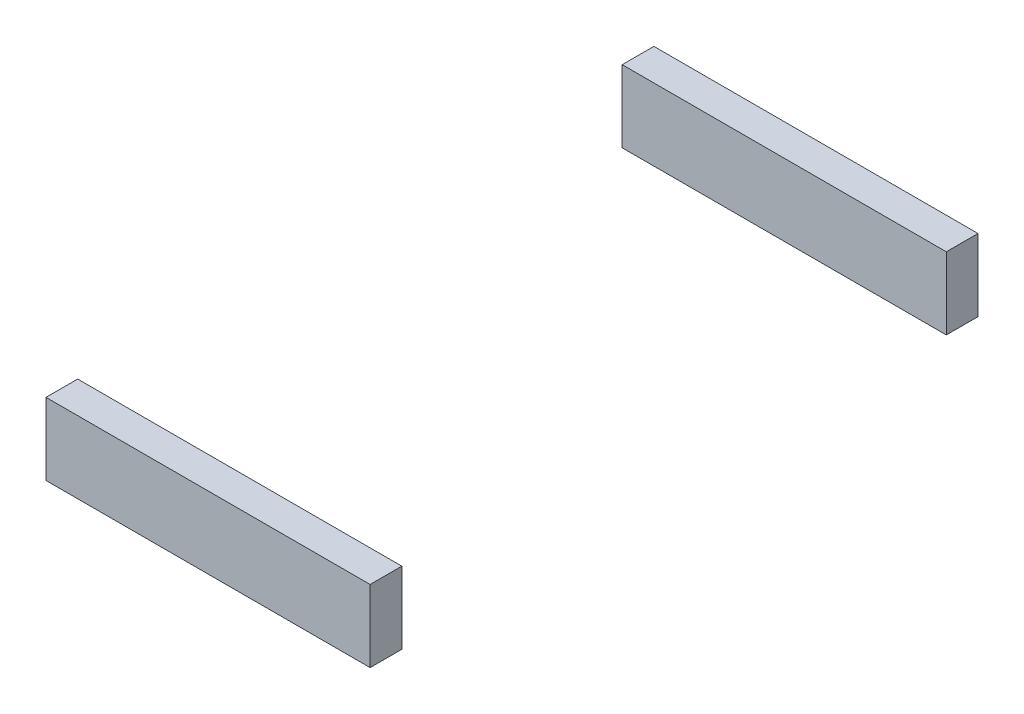
ISO-10303-21;
HEADER;
FILE_DESCRIPTION(('STEP AP214'),'2;1');
FILE_NAME('part.step','',(''),(''),'','','');
FILE_SCHEMA(('AUTOMOTIVE_DESIGN { 1 0 10303 214 1 1 1 1 }'));
ENDSEC;
DATA;
#1=APPLICATION_CONTEXT('core data for automotive mechanical design processes');
#2=APPLICATION_PROTOCOL_DEFINITION('international standard','automotive_design',2000,#1);
#3=PRODUCT_CONTEXT('',#1,'mechanical');
#4=PRODUCT('Part','Part','',(#3));
#5=PRODUCT_RELATED_PRODUCT_CATEGORY('part','',(#4));
#6=PRODUCT_DEFINITION_FORMATION('','',#4);
#7=PRODUCT_DEFINITION_CONTEXT('part definition',#1,'design');
#8=PRODUCT_DEFINITION('design','',#6,#7);
#9=PRODUCT_DEFINITION_SHAPE('','',#8);
#10=(LENGTH_UNIT() NAMED_UNIT(*) SI_UNIT(.MILLI.,.METRE.));
#11=(NAMED_UNIT(*) PLANE_ANGLE_UNIT() SI_UNIT($,.RADIAN.));
#12=(NAMED_UNIT(*) SI_UNIT($,.STERADIAN.) SOLID_ANGLE_UNIT());
#13=UNCERTAINTY_MEASURE_WITH_UNIT(LENGTH_MEASURE(1.E-05),#10,'distance_accuracy_value','');
#14=(GEOMETRIC_REPRESENTATION_CONTEXT(3) GLOBAL_UNCERTAINTY_ASSIGNED_CONTEXT((#13)) GLOBAL_UNIT_ASSIGNED_CONTEXT((#10,
#11,#12)) REPRESENTATION_CONTEXT('',''));
#15=CARTESIAN_POINT('',(0.,0.,0.));
#16=DIRECTION('',(0.,0.,1.));
#17=DIRECTION('',(1.,0.,0.));
#18=AXIS2_PLACEMENT_3D('',#15,#16,#17);
#19=CARTESIAN_POINT('',(-247.01,-0.01,422.));
#20=DIRECTION('',(0.,0.,1.));
#21=DIRECTION('',(1.,0.,0.));
#22=AXIS2_PLACEMENT_3D('',#19,#20,#21);
#23=PLANE('',#22);
#24=DIRECTION('',(1.,0.,0.));
#25=VECTOR('',#24,1.);
#26=CARTESIAN_POINT('',(-134.5,50.,422.));
#27=LINE('',#26,#25);
#28=CARTESIAN_POINT('',(-247.,50.,422.));
#29=VERTEX_POINT('',#28);
#30=CARTESIAN_POINT('',(-22.,50.,422.));
#31=VERTEX_POINT('',#30);
#32=EDGE_CURVE('P0_E69',#29,#31,#27,.T.);
#33=ORIENTED_EDGE('',*,*,#32,.F.);
#34=DIRECTION('',(0.,1.,0.));
#35=VECTOR('',#34,1.);
#36=CARTESIAN_POINT('',(-247.,25.,422.));
#37=LINE('',#36,#35);
#38=CARTESIAN_POINT('',(-247.,0.,422.));
#39=VERTEX_POINT('',#38);
#40=EDGE_CURVE('P0_E56',#39,#29,#37,.T.);
#41=ORIENTED_EDGE('',*,*,#40,.F.);
#42=DIRECTION('',(-1.,0.,0.));
#43=VECTOR('',#42,1.);
#44=CARTESIAN_POINT('',(-134.5,0.,422.));
#45=LINE('',#44,#43);
#46=CARTESIAN_POINT('',(-22.,0.,422.));
#47=VERTEX_POINT('',#46);
#48=EDGE_CURVE('P0_E21',#47,#39,#45,.T.);
#49=ORIENTED_EDGE('',*,*,#48,.F.);
#50=DIRECTION('',(0.,-1.,0.));
#51=VECTOR('',#50,1.);
#52=CARTESIAN_POINT('',(-22.,25.,422.));
#53=LINE('',#52,#51);
#54=EDGE_CURVE('P0_E82',#31,#47,#53,.T.);
#55=ORIENTED_EDGE('',*,*,#54,.F.);
#56=EDGE_LOOP('',(#33,#41,#49,#55));
#57=FACE_BOUND('',#56,.T.);
#58=ADVANCED_FACE('P0_F17',(#57),#23,.T.);
#59=CARTESIAN_POINT('',(-21.99,0.,422.01));
#60=DIRECTION('',(0.,-1.,0.));
#61=DIRECTION('',(-1.,0.,0.));
#62=AXIS2_PLACEMENT_3D('',#59,#60,#61);
#63=PLANE('',#62);
#64=DIRECTION('',(0.,0.,-1.));
#65=VECTOR('',#64,1.);
#66=CARTESIAN_POINT('',(-22.,0.,411.));
#67=LINE('',#66,#65);
#68=CARTESIAN_POINT('',(-22.,0.,400.));
#69=VERTEX_POINT('',#68);
#70=EDGE_CURVE('P0_E65',#47,#69,#67,.T.);
#71=ORIENTED_EDGE('',*,*,#70,.F.);
#72=ORIENTED_EDGE('',*,*,#48,.T.);
#73=DIRECTION('',(0.,0.,1.));
#74=VECTOR('',#73,1.);
#75=CARTESIAN_POINT('',(-247.,0.,411.));
#76=LINE('',#75,#74);
#77=CARTESIAN_POINT('',(-247.,0.,400.));
#78=VERTEX_POINT('',#77);
#79=EDGE_CURVE('P0_E62',#78,#39,#76,.T.);
#80=ORIENTED_EDGE('',*,*,#79,.F.);
#81=DIRECTION('',(-1.,0.,0.));
#82=VECTOR('',#81,1.);
#83=CARTESIAN_POINT('',(-134.5,0.,400.));
#84=LINE('',#83,#82);
#85=EDGE_CURVE('P0_E84',#69,#78,#84,.T.);
#86=ORIENTED_EDGE('',*,*,#85,.F.);
#87=EDGE_LOOP('',(#71,#72,#80,#86));
#88=FACE_BOUND('',#87,.T.);
#89=ADVANCED_FACE('P0_F61',(#88),#63,.T.);
#90=CARTESIAN_POINT('',(-247.,-0.01,399.99));
#91=DIRECTION('',(-1.,0.,0.));
#92=DIRECTION('',(0.,0.,1.));
#93=AXIS2_PLACEMENT_3D('',#90,#91,#92);
#94=PLANE('',#93);
#95=DIRECTION('',(0.,0.,1.));
#96=VECTOR('',#95,1.);
#97=CARTESIAN_POINT('',(-247.,50.,411.));
#98=LINE('',#97,#96);
#99=CARTESIAN_POINT('',(-247.,50.,400.));
#100=VERTEX_POINT('',#99);
#101=EDGE_CURVE('P0_E71',#100,#29,#98,.T.);
#102=ORIENTED_EDGE('',*,*,#101,.F.);
#103=DIRECTION('',(0.,1.,0.));
#104=VECTOR('',#103,1.);
#105=CARTESIAN_POINT('',(-247.,25.,400.));
#106=LINE('',#105,#104);
#107=EDGE_CURVE('P0_E75',#78,#100,#106,.T.);
#108=ORIENTED_EDGE('',*,*,#107,.F.);
#109=ORIENTED_EDGE('',*,*,#79,.T.);
#110=ORIENTED_EDGE('',*,*,#40,.T.);
#111=EDGE_LOOP('',(#102,#108,#109,#110));
#112=FACE_BOUND('',#111,.T.);
#113=ADVANCED_FACE('P0_F73',(#112),#94,.T.);
#114=CARTESIAN_POINT('',(-247.01,50.,399.99));
#115=DIRECTION('',(0.,1.,0.));
#116=DIRECTION('',(0.,0.,1.));
#117=AXIS2_PLACEMENT_3D('',#114,#115,#116);
#118=PLANE('',#117);
#119=DIRECTION('',(0.,0.,1.));
#120=VECTOR('',#119,1.);
#121=CARTESIAN_POINT('',(-22.,50.,411.));
#122=LINE('',#121,#120);
#123=CARTESIAN_POINT('',(-22.,50.,400.));
#124=VERTEX_POINT('',#123);
#125=EDGE_CURVE('P0_E36',#124,#31,#122,.T.);
#126=ORIENTED_EDGE('',*,*,#125,.F.);
#127=DIRECTION('',(1.,0.,0.));
#128=VECTOR('',#127,1.);
#129=CARTESIAN_POINT('',(-134.5,50.,400.));
#130=LINE('',#129,#128);
#131=EDGE_CURVE('P0_E27',#100,#124,#130,.T.);
#132=ORIENTED_EDGE('',*,*,#131,.F.);
#133=ORIENTED_EDGE('',*,*,#101,.T.);
#134=ORIENTED_EDGE('',*,*,#32,.T.);
#135=EDGE_LOOP('',(#126,#132,#133,#134));
#136=FACE_BOUND('',#135,.T.);
#137=ADVANCED_FACE('P0_F89',(#136),#118,.T.);
#138=CARTESIAN_POINT('',(-22.,-0.01,422.01));
#139=DIRECTION('',(1.,0.,0.));
#140=DIRECTION('',(0.,0.,-1.));
#141=AXIS2_PLACEMENT_3D('',#138,#139,#140);
#142=PLANE('',#141);
#143=ORIENTED_EDGE('',*,*,#125,.T.);
#144=ORIENTED_EDGE('',*,*,#54,.T.);
#145=ORIENTED_EDGE('',*,*,#70,.T.);
#146=DIRECTION('',(0.,-1.,0.));
#147=VECTOR('',#146,1.);
#148=CARTESIAN_POINT('',(-22.,25.,400.));
#149=LINE('',#148,#147);
#150=EDGE_CURVE('P0_E11',#124,#69,#149,.T.);
#151=ORIENTED_EDGE('',*,*,#150,.F.);
#152=EDGE_LOOP('',(#143,#144,#145,#151));
#153=FACE_BOUND('',#152,.T.);
#154=ADVANCED_FACE('P0_F91',(#153),#142,.T.);
#155=CARTESIAN_POINT('',(-21.99,-0.01,400.));
#156=DIRECTION('',(0.,0.,-1.));
#157=DIRECTION('',(-1.,0.,0.));
#158=AXIS2_PLACEMENT_3D('',#155,#156,#157);
#159=PLANE('',#158);
#160=ORIENTED_EDGE('',*,*,#131,.T.);
#161=ORIENTED_EDGE('',*,*,#150,.T.);
#162=ORIENTED_EDGE('',*,*,#85,.T.);
#163=ORIENTED_EDGE('',*,*,#107,.T.);
#164=EDGE_LOOP('',(#160,#161,#162,#163));
#165=FACE_BOUND('',#164,.T.);
#166=ADVANCED_FACE('P0_F19',(#165),#159,.T.);
#167=CLOSED_SHELL('',(#58,#89,#113,#137,#154,#166));
#168=MANIFOLD_SOLID_BREP('P0_B1',#167);
#169=CARTESIAN_POINT('',(-247.01,-0.01,22.));
#170=DIRECTION('',(0.,0.,1.));
#171=DIRECTION('',(1.,0.,0.));
#172=AXIS2_PLACEMENT_3D('',#169,#170,#171);
#173=PLANE('',#172);
#174=DIRECTION('',(1.,0.,0.));
#175=VECTOR('',#174,1.);
#176=CARTESIAN_POINT('',(-134.5,50.,22.));
#177=LINE('',#176,#175);
#178=CARTESIAN_POINT('',(-247.,50.,22.));
#179=VERTEX_POINT('',#178);
#180=CARTESIAN_POINT('',(-22.,50.,22.));
#181=VERTEX_POINT('',#180);
#182=EDGE_CURVE('P1_E69',#179,#181,#177,.T.);
#183=ORIENTED_EDGE('',*,*,#182,.F.);
#184=DIRECTION('',(0.,1.,0.));
#185=VECTOR('',#184,1.);
#186=CARTESIAN_POINT('',(-247.,25.,22.));
#187=LINE('',#186,#185);
#188=CARTESIAN_POINT('',(-247.,0.,22.));
#189=VERTEX_POINT('',#188);
#190=EDGE_CURVE('P1_E56',#189,#179,#187,.T.);
#191=ORIENTED_EDGE('',*,*,#190,.F.);
#192=DIRECTION('',(-1.,0.,0.));
#193=VECTOR('',#192,1.);
#194=CARTESIAN_POINT('',(-134.5,0.,22.));
#195=LINE('',#194,#193);
#196=CARTESIAN_POINT('',(-22.,0.,22.));
#197=VERTEX_POINT('',#196);
#198=EDGE_CURVE('P1_E21',#197,#189,#195,.T.);
#199=ORIENTED_EDGE('',*,*,#198,.F.);
#200=DIRECTION('',(0.,-1.,0.));
#201=VECTOR('',#200,1.);
#202=CARTESIAN_POINT('',(-22.,25.,22.));
#203=LINE('',#202,#201);
#204=EDGE_CURVE('P1_E82',#181,#197,#203,.T.);
#205=ORIENTED_EDGE('',*,*,#204,.F.);
#206=EDGE_LOOP('',(#183,#191,#199,#205));
#207=FACE_BOUND('',#206,.T.);
#208=ADVANCED_FACE('P1_F17',(#207),#173,.T.);
#209=CARTESIAN_POINT('',(-21.99,0.,22.01));
#210=DIRECTION('',(0.,-1.,0.));
#211=DIRECTION('',(-1.,0.,0.));
#212=AXIS2_PLACEMENT_3D('',#209,#210,#211);
#213=PLANE('',#212);
#214=DIRECTION('',(0.,0.,-1.));
#215=VECTOR('',#214,1.);
#216=CARTESIAN_POINT('',(-22.,0.,11.));
#217=LINE('',#216,#215);
#218=CARTESIAN_POINT('',(-22.,0.,0.));
#219=VERTEX_POINT('',#218);
#220=EDGE_CURVE('P1_E65',#197,#219,#217,.T.);
#221=ORIENTED_EDGE('',*,*,#220,.F.);
#222=ORIENTED_EDGE('',*,*,#198,.T.);
#223=DIRECTION('',(0.,0.,1.));
#224=VECTOR('',#223,1.);
#225=CARTESIAN_POINT('',(-247.,0.,11.));
#226=LINE('',#225,#224);
#227=CARTESIAN_POINT('',(-247.,0.,0.));
#228=VERTEX_POINT('',#227);
#229=EDGE_CURVE('P1_E62',#228,#189,#226,.T.);
#230=ORIENTED_EDGE('',*,*,#229,.F.);
#231=DIRECTION('',(-1.,0.,0.));
#232=VECTOR('',#231,1.);
#233=CARTESIAN_POINT('',(-134.5,0.,0.));
#234=LINE('',#233,#232);
#235=EDGE_CURVE('P1_E84',#219,#228,#234,.T.);
#236=ORIENTED_EDGE('',*,*,#235,.F.);
#237=EDGE_LOOP('',(#221,#222,#230,#236));
#238=FACE_BOUND('',#237,.T.);
#239=ADVANCED_FACE('P1_F61',(#238),#213,.T.);
#240=CARTESIAN_POINT('',(-247.,-0.01,-0.01));
#241=DIRECTION('',(-1.,0.,0.));
#242=DIRECTION('',(0.,0.,1.));
#243=AXIS2_PLACEMENT_3D('',#240,#241,#242);
#244=PLANE('',#243);
#245=DIRECTION('',(0.,0.,1.));
#246=VECTOR('',#245,1.);
#247=CARTESIAN_POINT('',(-247.,50.,11.));
#248=LINE('',#247,#246);
#249=CARTESIAN_POINT('',(-247.,50.,0.));
#250=VERTEX_POINT('',#249);
#251=EDGE_CURVE('P1_E71',#250,#179,#248,.T.);
#252=ORIENTED_EDGE('',*,*,#251,.F.);
#253=DIRECTION('',(0.,1.,0.));
#254=VECTOR('',#253,1.);
#255=CARTESIAN_POINT('',(-247.,25.,0.));
#256=LINE('',#255,#254);
#257=EDGE_CURVE('P1_E75',#228,#250,#256,.T.);
#258=ORIENTED_EDGE('',*,*,#257,.F.);
#259=ORIENTED_EDGE('',*,*,#229,.T.);
#260=ORIENTED_EDGE('',*,*,#190,.T.);
#261=EDGE_LOOP('',(#252,#258,#259,#260));
#262=FACE_BOUND('',#261,.T.);
#263=ADVANCED_FACE('P1_F73',(#262),#244,.T.);
#264=CARTESIAN_POINT('',(-247.01,50.,-0.00999999999999891));
#265=DIRECTION('',(0.,1.,0.));
#266=DIRECTION('',(0.,0.,1.));
#267=AXIS2_PLACEMENT_3D('',#264,#265,#266);
#268=PLANE('',#267);
#269=DIRECTION('',(0.,0.,1.));
#270=VECTOR('',#269,1.);
#271=CARTESIAN_POINT('',(-22.,50.,11.));
#272=LINE('',#271,#270);
#273=CARTESIAN_POINT('',(-22.,50.,0.));
#274=VERTEX_POINT('',#273);
#275=EDGE_CURVE('P1_E36',#274,#181,#272,.T.);
#276=ORIENTED_EDGE('',*,*,#275,.F.);
#277=DIRECTION('',(1.,0.,0.));
#278=VECTOR('',#277,1.);
#279=CARTESIAN_POINT('',(-134.5,50.,0.));
#280=LINE('',#279,#278);
#281=EDGE_CURVE('P1_E27',#250,#274,#280,.T.);
#282=ORIENTED_EDGE('',*,*,#281,.F.);
#283=ORIENTED_EDGE('',*,*,#251,.T.);
#284=ORIENTED_EDGE('',*,*,#182,.T.);
#285=EDGE_LOOP('',(#276,#282,#283,#284));
#286=FACE_BOUND('',#285,.T.);
#287=ADVANCED_FACE('P1_F89',(#286),#268,.T.);
#288=CARTESIAN_POINT('',(-22.,-0.01,22.01));
#289=DIRECTION('',(1.,0.,0.));
#290=DIRECTION('',(0.,0.,-1.));
#291=AXIS2_PLACEMENT_3D('',#288,#289,#290);
#292=PLANE('',#291);
#293=ORIENTED_EDGE('',*,*,#275,.T.);
#294=ORIENTED_EDGE('',*,*,#204,.T.);
#295=ORIENTED_EDGE('',*,*,#220,.T.);
#296=DIRECTION('',(0.,-1.,0.));
#297=VECTOR('',#296,1.);
#298=CARTESIAN_POINT('',(-22.,25.,0.));
#299=LINE('',#298,#297);
#300=EDGE_CURVE('P1_E11',#274,#219,#299,.T.);
#301=ORIENTED_EDGE('',*,*,#300,.F.);
#302=EDGE_LOOP('',(#293,#294,#295,#301));
#303=FACE_BOUND('',#302,.T.);
#304=ADVANCED_FACE('P1_F91',(#303),#292,.T.);
#305=CARTESIAN_POINT('',(-21.99,-0.01,0.));
#306=DIRECTION('',(0.,0.,-1.));
#307=DIRECTION('',(-1.,0.,0.));
#308=AXIS2_PLACEMENT_3D('',#305,#306,#307);
#309=PLANE('',#308);
#310=ORIENTED_EDGE('',*,*,#281,.T.);
#311=ORIENTED_EDGE('',*,*,#300,.T.);
#312=ORIENTED_EDGE('',*,*,#235,.T.);
#313=ORIENTED_EDGE('',*,*,#257,.T.);
#314=EDGE_LOOP('',(#310,#311,#312,#313));
#315=FACE_BOUND('',#314,.T.);
#316=ADVANCED_FACE('P1_F19',(#315),#309,.T.);
#317=CLOSED_SHELL('',(#208,#239,#263,#287,#304,#316));
#318=MANIFOLD_SOLID_BREP('P1_B1',#317);
#319=ADVANCED_BREP_SHAPE_REPRESENTATION('',(#18,#168,#318),#14);
#320=SHAPE_DEFINITION_REPRESENTATION(#9,#319);
ENDSEC;
END-ISO-10303-21;
